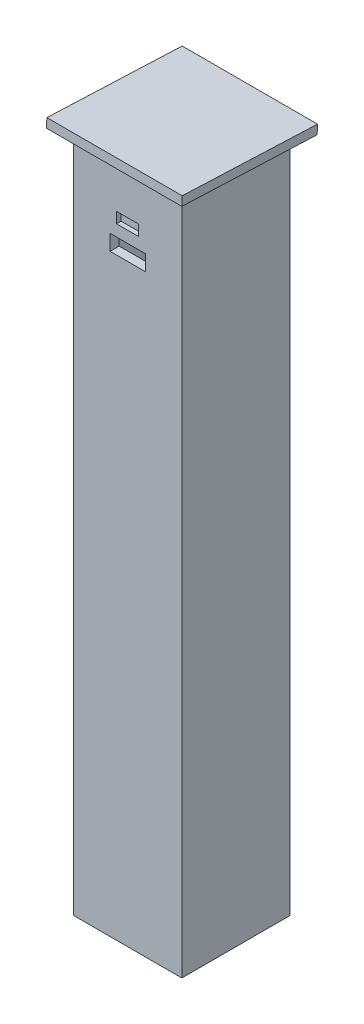
ISO-10303-21;
HEADER;
FILE_DESCRIPTION(('STEP AP214'),'2;1');
FILE_NAME('part.step','',(''),(''),'','','');
FILE_SCHEMA(('AUTOMOTIVE_DESIGN { 1 0 10303 214 1 1 1 1 }'));
ENDSEC;
DATA;
#1=APPLICATION_CONTEXT('core data for automotive mechanical design processes');
#2=APPLICATION_PROTOCOL_DEFINITION('international standard','automotive_design',2000,#1);
#3=PRODUCT_CONTEXT('',#1,'mechanical');
#4=PRODUCT('Part','Part','',(#3));
#5=PRODUCT_RELATED_PRODUCT_CATEGORY('part','',(#4));
#6=PRODUCT_DEFINITION_FORMATION('','',#4);
#7=PRODUCT_DEFINITION_CONTEXT('part definition',#1,'design');
#8=PRODUCT_DEFINITION('design','',#6,#7);
#9=PRODUCT_DEFINITION_SHAPE('','',#8);
#10=(LENGTH_UNIT() NAMED_UNIT(*) SI_UNIT(.MILLI.,.METRE.));
#11=(NAMED_UNIT(*) PLANE_ANGLE_UNIT() SI_UNIT($,.RADIAN.));
#12=(NAMED_UNIT(*) SI_UNIT($,.STERADIAN.) SOLID_ANGLE_UNIT());
#13=UNCERTAINTY_MEASURE_WITH_UNIT(LENGTH_MEASURE(1.E-05),#10,'distance_accuracy_value','');
#14=(GEOMETRIC_REPRESENTATION_CONTEXT(3) GLOBAL_UNCERTAINTY_ASSIGNED_CONTEXT((#13)) GLOBAL_UNIT_ASSIGNED_CONTEXT((#10,
#11,#12)) REPRESENTATION_CONTEXT('',''));
#15=CARTESIAN_POINT('',(0.,0.,0.));
#16=DIRECTION('',(0.,0.,1.));
#17=DIRECTION('',(1.,0.,0.));
#18=AXIS2_PLACEMENT_3D('',#15,#16,#17);
#19=CARTESIAN_POINT('',(0.,0.,0.));
#20=DIRECTION('',(0.,1.,0.));
#21=DIRECTION('',(0.,0.,1.));
#22=AXIS2_PLACEMENT_3D('',#19,#20,#21);
#23=PLANE('',#22);
#24=DIRECTION('',(0.,0.,1.));
#25=VECTOR('',#24,1.);
#26=CARTESIAN_POINT('',(-283.32278927247,0.,-148.351621739989));
#27=LINE('',#26,#25);
#28=CARTESIAN_POINT('',(-283.32278927247,0.,-148.351621739989));
#29=VERTEX_POINT('',#28);
#30=CARTESIAN_POINT('',(-283.32278927247,0.,91.6483782600111));
#31=VERTEX_POINT('',#30);
#32=EDGE_CURVE('E313',#29,#31,#27,.T.);
#33=ORIENTED_EDGE('',*,*,#32,.F.);
#34=DIRECTION('',(-1.,0.,0.));
#35=VECTOR('',#34,1.);
#36=CARTESIAN_POINT('',(-283.32278927247,0.,-148.351621739989));
#37=LINE('',#36,#35);
#38=CARTESIAN_POINT('',(-43.3227892724702,0.,-148.351621739989));
#39=VERTEX_POINT('',#38);
#40=EDGE_CURVE('E317',#39,#29,#37,.T.);
#41=ORIENTED_EDGE('',*,*,#40,.F.);
#42=DIRECTION('',(0.,0.,-1.));
#43=VECTOR('',#42,1.);
#44=CARTESIAN_POINT('',(-43.3227892724702,0.,-148.351621739989));
#45=LINE('',#44,#43);
#46=CARTESIAN_POINT('',(-43.3227892724702,0.,91.6483782600111));
#47=VERTEX_POINT('',#46);
#48=EDGE_CURVE('E322',#47,#39,#45,.T.);
#49=ORIENTED_EDGE('',*,*,#48,.F.);
#50=DIRECTION('',(1.,0.,0.));
#51=VECTOR('',#50,1.);
#52=CARTESIAN_POINT('',(-283.32278927247,0.,91.6483782600111));
#53=LINE('',#52,#51);
#54=EDGE_CURVE('E320',#31,#47,#53,.T.);
#55=ORIENTED_EDGE('',*,*,#54,.F.);
#56=EDGE_LOOP('',(#33,#41,#49,#55));
#57=FACE_BOUND('',#56,.T.);
#58=DIRECTION('',(0.,0.,1.));
#59=VECTOR('',#58,1.);
#60=CARTESIAN_POINT('',(-263.32278927247,0.,-128.351621739989));
#61=LINE('',#60,#59);
#62=CARTESIAN_POINT('',(-263.32278927247,0.,-128.351621739989));
#63=VERTEX_POINT('',#62);
#64=CARTESIAN_POINT('',(-263.32278927247,0.,71.6483782600111));
#65=VERTEX_POINT('',#64);
#66=EDGE_CURVE('E279',#63,#65,#61,.T.);
#67=ORIENTED_EDGE('',*,*,#66,.T.);
#68=DIRECTION('',(1.,0.,0.));
#69=VECTOR('',#68,1.);
#70=CARTESIAN_POINT('',(-263.32278927247,0.,71.6483782600111));
#71=LINE('',#70,#69);
#72=CARTESIAN_POINT('',(-63.3227892724702,0.,71.6483782600111));
#73=VERTEX_POINT('',#72);
#74=EDGE_CURVE('E296',#65,#73,#71,.T.);
#75=ORIENTED_EDGE('',*,*,#74,.T.);
#76=DIRECTION('',(0.,0.,-1.));
#77=VECTOR('',#76,1.);
#78=CARTESIAN_POINT('',(-63.3227892724702,0.,-128.351621739989));
#79=LINE('',#78,#77);
#80=CARTESIAN_POINT('',(-63.3227892724702,0.,-128.351621739989));
#81=VERTEX_POINT('',#80);
#82=EDGE_CURVE('E299',#73,#81,#79,.T.);
#83=ORIENTED_EDGE('',*,*,#82,.T.);
#84=DIRECTION('',(-1.,0.,0.));
#85=VECTOR('',#84,1.);
#86=CARTESIAN_POINT('',(-263.32278927247,0.,-128.351621739989));
#87=LINE('',#86,#85);
#88=EDGE_CURVE('E284',#81,#63,#87,.T.);
#89=ORIENTED_EDGE('',*,*,#88,.T.);
#90=EDGE_LOOP('',(#67,#75,#83,#89));
#91=FACE_BOUND('',#90,.T.);
#92=ADVANCED_FACE('F34',(#57,#91),#23,.F.);
#93=CARTESIAN_POINT('',(-283.32278927247,1500.,-148.351621739989));
#94=DIRECTION('',(1.,0.,0.));
#95=DIRECTION('',(0.,0.,-1.));
#96=AXIS2_PLACEMENT_3D('',#93,#94,#95);
#97=PLANE('',#96);
#98=ORIENTED_EDGE('',*,*,#32,.T.);
#99=DIRECTION('',(0.,-1.,0.));
#100=VECTOR('',#99,1.);
#101=CARTESIAN_POINT('',(-283.32278927247,1500.,91.6483782600111));
#102=LINE('',#101,#100);
#103=CARTESIAN_POINT('',(-283.32278927247,1510.,91.6483782600111));
#104=VERTEX_POINT('',#103);
#105=EDGE_CURVE('E11',#104,#31,#102,.T.);
#106=ORIENTED_EDGE('',*,*,#105,.F.);
#107=DIRECTION('',(0.,-0.0416305447121814,-0.999133073092352));
#108=VECTOR('',#107,1.);
#109=CARTESIAN_POINT('',(-283.32278927247,1510.,91.6483782600111));
#110=LINE('',#109,#108);
#111=CARTESIAN_POINT('',(-283.32278927247,1500.,-148.351621739989));
#112=VERTEX_POINT('',#111);
#113=EDGE_CURVE('E240',#104,#112,#110,.T.);
#114=ORIENTED_EDGE('',*,*,#113,.T.);
#115=DIRECTION('',(0.,-1.,0.));
#116=VECTOR('',#115,1.);
#117=CARTESIAN_POINT('',(-283.32278927247,1500.,-148.351621739989));
#118=LINE('',#117,#116);
#119=EDGE_CURVE('E316',#112,#29,#118,.T.);
#120=ORIENTED_EDGE('',*,*,#119,.T.);
#121=EDGE_LOOP('',(#98,#106,#114,#120));
#122=FACE_BOUND('',#121,.T.);
#123=ADVANCED_FACE('F36',(#122),#97,.F.);
#124=CARTESIAN_POINT('',(-283.32278927247,1500.,91.6483782600111));
#125=DIRECTION('',(0.,0.,-1.));
#126=DIRECTION('',(-1.,0.,0.));
#127=AXIS2_PLACEMENT_3D('',#124,#125,#126);
#128=PLANE('',#127);
#129=DIRECTION('',(1.,0.,0.));
#130=VECTOR('',#129,1.);
#131=CARTESIAN_POINT('',(-187.82278927247,1375.5,91.6483782600111));
#132=LINE('',#131,#130);
#133=CARTESIAN_POINT('',(-187.82278927247,1375.5,91.6483782600111));
#134=VERTEX_POINT('',#133);
#135=CARTESIAN_POINT('',(-138.82278927247,1375.5,91.6483782600111));
#136=VERTEX_POINT('',#135);
#137=EDGE_CURVE('E201',#134,#136,#132,.T.);
#138=ORIENTED_EDGE('',*,*,#137,.F.);
#139=DIRECTION('',(0.,-1.,0.));
#140=VECTOR('',#139,1.);
#141=CARTESIAN_POINT('',(-187.82278927247,1399.5,91.6483782600111));
#142=LINE('',#141,#140);
#143=CARTESIAN_POINT('',(-187.82278927247,1399.5,91.6483782600111));
#144=VERTEX_POINT('',#143);
#145=EDGE_CURVE('E49',#144,#134,#142,.T.);
#146=ORIENTED_EDGE('',*,*,#145,.F.);
#147=DIRECTION('',(-1.,0.,0.));
#148=VECTOR('',#147,1.);
#149=CARTESIAN_POINT('',(-187.82278927247,1399.5,91.6483782600111));
#150=LINE('',#149,#148);
#151=CARTESIAN_POINT('',(-138.82278927247,1399.5,91.6483782600111));
#152=VERTEX_POINT('',#151);
#153=EDGE_CURVE('E192',#152,#144,#150,.T.);
#154=ORIENTED_EDGE('',*,*,#153,.F.);
#155=DIRECTION('',(0.,1.,0.));
#156=VECTOR('',#155,1.);
#157=CARTESIAN_POINT('',(-138.82278927247,1399.5,91.6483782600111));
#158=LINE('',#157,#156);
#159=EDGE_CURVE('E195',#136,#152,#158,.T.);
#160=ORIENTED_EDGE('',*,*,#159,.F.);
#161=EDGE_LOOP('',(#138,#146,#154,#160));
#162=FACE_BOUND('',#161,.T.);
#163=DIRECTION('',(0.,1.,0.));
#164=VECTOR('',#163,1.);
#165=CARTESIAN_POINT('',(-124.32278927247,1350.,91.6483782600111));
#166=LINE('',#165,#164);
#167=CARTESIAN_POINT('',(-124.32278927247,1315.5,91.6483782600111));
#168=VERTEX_POINT('',#167);
#169=CARTESIAN_POINT('',(-124.32278927247,1350.,91.6483782600111));
#170=VERTEX_POINT('',#169);
#171=EDGE_CURVE('E252',#168,#170,#166,.T.);
#172=ORIENTED_EDGE('',*,*,#171,.F.);
#173=DIRECTION('',(1.,0.,0.));
#174=VECTOR('',#173,1.);
#175=CARTESIAN_POINT('',(-202.32278927247,1315.5,91.6483782600111));
#176=LINE('',#175,#174);
#177=CARTESIAN_POINT('',(-202.32278927247,1315.5,91.6483782600111));
#178=VERTEX_POINT('',#177);
#179=EDGE_CURVE('E255',#178,#168,#176,.T.);
#180=ORIENTED_EDGE('',*,*,#179,.F.);
#181=DIRECTION('',(0.,-1.,0.));
#182=VECTOR('',#181,1.);
#183=CARTESIAN_POINT('',(-202.32278927247,1350.,91.6483782600111));
#184=LINE('',#183,#182);
#185=CARTESIAN_POINT('',(-202.32278927247,1350.,91.6483782600111));
#186=VERTEX_POINT('',#185);
#187=EDGE_CURVE('E244',#186,#178,#184,.T.);
#188=ORIENTED_EDGE('',*,*,#187,.F.);
#189=DIRECTION('',(-1.,0.,0.));
#190=VECTOR('',#189,1.);
#191=CARTESIAN_POINT('',(-202.32278927247,1350.,91.6483782600111));
#192=LINE('',#191,#190);
#193=EDGE_CURVE('E57',#170,#186,#192,.T.);
#194=ORIENTED_EDGE('',*,*,#193,.F.);
#195=EDGE_LOOP('',(#172,#180,#188,#194));
#196=FACE_BOUND('',#195,.T.);
#197=ORIENTED_EDGE('',*,*,#54,.T.);
#198=DIRECTION('',(0.,-1.,0.));
#199=VECTOR('',#198,1.);
#200=CARTESIAN_POINT('',(-43.3227892724702,1500.,91.6483782600111));
#201=LINE('',#200,#199);
#202=CARTESIAN_POINT('',(-43.3227892724702,1510.,91.6483782600111));
#203=VERTEX_POINT('',#202);
#204=EDGE_CURVE('E42',#203,#47,#201,.T.);
#205=ORIENTED_EDGE('',*,*,#204,.F.);
#206=DIRECTION('',(-1.,0.,0.));
#207=VECTOR('',#206,1.);
#208=CARTESIAN_POINT('',(196.885453716816,1510.,91.6483782600111));
#209=LINE('',#208,#207);
#210=EDGE_CURVE('E245',#203,#104,#209,.T.);
#211=ORIENTED_EDGE('',*,*,#210,.T.);
#212=ORIENTED_EDGE('',*,*,#105,.T.);
#213=EDGE_LOOP('',(#197,#205,#211,#212));
#214=FACE_BOUND('',#213,.T.);
#215=ADVANCED_FACE('F349',(#162,#196,#214),#128,.F.);
#216=CARTESIAN_POINT('',(-43.3227892724702,1500.,-148.351621739989));
#217=DIRECTION('',(-1.,0.,0.));
#218=DIRECTION('',(0.,0.,1.));
#219=AXIS2_PLACEMENT_3D('',#216,#217,#218);
#220=PLANE('',#219);
#221=ORIENTED_EDGE('',*,*,#48,.T.);
#222=DIRECTION('',(0.,-1.,0.));
#223=VECTOR('',#222,1.);
#224=CARTESIAN_POINT('',(-43.3227892724702,1500.,-148.351621739989));
#225=LINE('',#224,#223);
#226=CARTESIAN_POINT('',(-43.3227892724702,1500.,-148.351621739989));
#227=VERTEX_POINT('',#226);
#228=EDGE_CURVE('E327',#227,#39,#225,.T.);
#229=ORIENTED_EDGE('',*,*,#228,.F.);
#230=DIRECTION('',(0.,0.0416305447121814,0.999133073092352));
#231=VECTOR('',#230,1.);
#232=CARTESIAN_POINT('',(-43.3227892724702,1510.,91.6483782600111));
#233=LINE('',#232,#231);
#234=EDGE_CURVE('E241',#227,#203,#233,.T.);
#235=ORIENTED_EDGE('',*,*,#234,.T.);
#236=ORIENTED_EDGE('',*,*,#204,.T.);
#237=EDGE_LOOP('',(#221,#229,#235,#236));
#238=FACE_BOUND('',#237,.T.);
#239=ADVANCED_FACE('F333',(#238),#220,.F.);
#240=CARTESIAN_POINT('',(-283.32278927247,1500.,-148.351621739989));
#241=DIRECTION('',(0.,0.,1.));
#242=DIRECTION('',(1.,0.,0.));
#243=AXIS2_PLACEMENT_3D('',#240,#241,#242);
#244=PLANE('',#243);
#245=ORIENTED_EDGE('',*,*,#40,.T.);
#246=ORIENTED_EDGE('',*,*,#119,.F.);
#247=DIRECTION('',(-1.,0.,0.));
#248=VECTOR('',#247,1.);
#249=CARTESIAN_POINT('',(-283.32278927247,1500.,-148.351621739989));
#250=LINE('',#249,#248);
#251=EDGE_CURVE('E314',#227,#112,#250,.T.);
#252=ORIENTED_EDGE('',*,*,#251,.F.);
#253=ORIENTED_EDGE('',*,*,#228,.T.);
#254=EDGE_LOOP('',(#245,#246,#252,#253));
#255=FACE_BOUND('',#254,.T.);
#256=ADVANCED_FACE('F342',(#255),#244,.F.);
#257=CARTESIAN_POINT('',(-263.32278927247,1500.,-128.351621739989));
#258=DIRECTION('',(1.,0.,0.));
#259=DIRECTION('',(0.,0.,-1.));
#260=AXIS2_PLACEMENT_3D('',#257,#258,#259);
#261=PLANE('',#260);
#262=ORIENTED_EDGE('',*,*,#66,.F.);
#263=DIRECTION('',(0.,-1.,0.));
#264=VECTOR('',#263,1.);
#265=CARTESIAN_POINT('',(-263.32278927247,1500.,-128.351621739989));
#266=LINE('',#265,#264);
#267=CARTESIAN_POINT('',(-263.32278927247,1500.,-128.351621739989));
#268=VERTEX_POINT('',#267);
#269=EDGE_CURVE('E293',#268,#63,#266,.T.);
#270=ORIENTED_EDGE('',*,*,#269,.F.);
#271=DIRECTION('',(0.,0.,1.));
#272=VECTOR('',#271,1.);
#273=CARTESIAN_POINT('',(-263.32278927247,1500.,-128.351621739989));
#274=LINE('',#273,#272);
#275=CARTESIAN_POINT('',(-263.32278927247,1500.,71.6483782600111));
#276=VERTEX_POINT('',#275);
#277=EDGE_CURVE('E280',#268,#276,#274,.T.);
#278=ORIENTED_EDGE('',*,*,#277,.T.);
#279=DIRECTION('',(0.,-1.,0.));
#280=VECTOR('',#279,1.);
#281=CARTESIAN_POINT('',(-263.32278927247,1500.,71.6483782600111));
#282=LINE('',#281,#280);
#283=EDGE_CURVE('E310',#276,#65,#282,.T.);
#284=ORIENTED_EDGE('',*,*,#283,.T.);
#285=EDGE_LOOP('',(#262,#270,#278,#284));
#286=FACE_BOUND('',#285,.T.);
#287=ADVANCED_FACE('F364',(#286),#261,.T.);
#288=CARTESIAN_POINT('',(-263.32278927247,1500.,71.6483782600111));
#289=DIRECTION('',(0.,0.,-1.));
#290=DIRECTION('',(-1.,0.,0.));
#291=AXIS2_PLACEMENT_3D('',#288,#289,#290);
#292=PLANE('',#291);
#293=DIRECTION('',(1.,0.,0.));
#294=VECTOR('',#293,1.);
#295=CARTESIAN_POINT('',(-202.32278927247,1315.5,71.6483782600111));
#296=LINE('',#295,#294);
#297=CARTESIAN_POINT('',(-202.32278927247,1315.5,71.6483782600111));
#298=VERTEX_POINT('',#297);
#299=CARTESIAN_POINT('',(-124.32278927247,1315.5,71.6483782600111));
#300=VERTEX_POINT('',#299);
#301=EDGE_CURVE('E251',#298,#300,#296,.T.);
#302=ORIENTED_EDGE('',*,*,#301,.T.);
#303=DIRECTION('',(0.,1.,0.));
#304=VECTOR('',#303,1.);
#305=CARTESIAN_POINT('',(-124.32278927247,1350.,71.6483782600111));
#306=LINE('',#305,#304);
#307=CARTESIAN_POINT('',(-124.32278927247,1350.,71.6483782600111));
#308=VERTEX_POINT('',#307);
#309=EDGE_CURVE('E272',#300,#308,#306,.T.);
#310=ORIENTED_EDGE('',*,*,#309,.T.);
#311=DIRECTION('',(-1.,0.,0.));
#312=VECTOR('',#311,1.);
#313=CARTESIAN_POINT('',(-202.32278927247,1350.,71.6483782600111));
#314=LINE('',#313,#312);
#315=CARTESIAN_POINT('',(-202.32278927247,1350.,71.6483782600111));
#316=VERTEX_POINT('',#315);
#317=EDGE_CURVE('E268',#308,#316,#314,.T.);
#318=ORIENTED_EDGE('',*,*,#317,.T.);
#319=DIRECTION('',(0.,-1.,0.));
#320=VECTOR('',#319,1.);
#321=CARTESIAN_POINT('',(-202.32278927247,1350.,71.6483782600111));
#322=LINE('',#321,#320);
#323=EDGE_CURVE('E263',#316,#298,#322,.T.);
#324=ORIENTED_EDGE('',*,*,#323,.T.);
#325=EDGE_LOOP('',(#302,#310,#318,#324));
#326=FACE_BOUND('',#325,.T.);
#327=ORIENTED_EDGE('',*,*,#74,.F.);
#328=ORIENTED_EDGE('',*,*,#283,.F.);
#329=DIRECTION('',(1.,0.,0.));
#330=VECTOR('',#329,1.);
#331=CARTESIAN_POINT('',(-263.32278927247,1500.,71.6483782600111));
#332=LINE('',#331,#330);
#333=CARTESIAN_POINT('',(-63.3227892724702,1500.,71.6483782600111));
#334=VERTEX_POINT('',#333);
#335=EDGE_CURVE('E283',#276,#334,#332,.T.);
#336=ORIENTED_EDGE('',*,*,#335,.T.);
#337=DIRECTION('',(0.,-1.,0.));
#338=VECTOR('',#337,1.);
#339=CARTESIAN_POINT('',(-63.3227892724702,1500.,71.6483782600111));
#340=LINE('',#339,#338);
#341=EDGE_CURVE('E308',#334,#73,#340,.T.);
#342=ORIENTED_EDGE('',*,*,#341,.T.);
#343=EDGE_LOOP('',(#327,#328,#336,#342));
#344=FACE_BOUND('',#343,.T.);
#345=ADVANCED_FACE('F370',(#326,#344),#292,.T.);
#346=CARTESIAN_POINT('',(-63.3227892724702,1500.,-128.351621739989));
#347=DIRECTION('',(-1.,0.,0.));
#348=DIRECTION('',(0.,0.,1.));
#349=AXIS2_PLACEMENT_3D('',#346,#347,#348);
#350=PLANE('',#349);
#351=ORIENTED_EDGE('',*,*,#82,.F.);
#352=ORIENTED_EDGE('',*,*,#341,.F.);
#353=DIRECTION('',(0.,0.,-1.));
#354=VECTOR('',#353,1.);
#355=CARTESIAN_POINT('',(-63.3227892724702,1500.,-128.351621739989));
#356=LINE('',#355,#354);
#357=CARTESIAN_POINT('',(-63.3227892724702,1500.,-128.351621739989));
#358=VERTEX_POINT('',#357);
#359=EDGE_CURVE('E287',#334,#358,#356,.T.);
#360=ORIENTED_EDGE('',*,*,#359,.T.);
#361=DIRECTION('',(0.,-1.,0.));
#362=VECTOR('',#361,1.);
#363=CARTESIAN_POINT('',(-63.3227892724702,1500.,-128.351621739989));
#364=LINE('',#363,#362);
#365=EDGE_CURVE('E306',#358,#81,#364,.T.);
#366=ORIENTED_EDGE('',*,*,#365,.T.);
#367=EDGE_LOOP('',(#351,#352,#360,#366));
#368=FACE_BOUND('',#367,.T.);
#369=ADVANCED_FACE('F375',(#368),#350,.T.);
#370=CARTESIAN_POINT('',(-263.32278927247,1500.,-128.351621739989));
#371=DIRECTION('',(0.,0.,1.));
#372=DIRECTION('',(1.,0.,0.));
#373=AXIS2_PLACEMENT_3D('',#370,#371,#372);
#374=PLANE('',#373);
#375=ORIENTED_EDGE('',*,*,#88,.F.);
#376=ORIENTED_EDGE('',*,*,#365,.F.);
#377=DIRECTION('',(-1.,0.,0.));
#378=VECTOR('',#377,1.);
#379=CARTESIAN_POINT('',(-263.32278927247,1500.,-128.351621739989));
#380=LINE('',#379,#378);
#381=EDGE_CURVE('E290',#358,#268,#380,.T.);
#382=ORIENTED_EDGE('',*,*,#381,.T.);
#383=ORIENTED_EDGE('',*,*,#269,.T.);
#384=EDGE_LOOP('',(#375,#376,#382,#383));
#385=FACE_BOUND('',#384,.T.);
#386=ADVANCED_FACE('F381',(#385),#374,.T.);
#387=CARTESIAN_POINT('',(-202.32278927247,1315.5,-13.6408355949659));
#388=DIRECTION('',(0.,-1.,0.));
#389=DIRECTION('',(0.,0.,-1.));
#390=AXIS2_PLACEMENT_3D('',#387,#388,#389);
#391=PLANE('',#390);
#392=DIRECTION('',(0.,0.,1.));
#393=VECTOR('',#392,1.);
#394=CARTESIAN_POINT('',(-202.32278927247,1315.5,-13.6408355949659));
#395=LINE('',#394,#393);
#396=EDGE_CURVE('E266',#298,#178,#395,.T.);
#397=ORIENTED_EDGE('',*,*,#396,.T.);
#398=ORIENTED_EDGE('',*,*,#179,.T.);
#399=DIRECTION('',(0.,0.,1.));
#400=VECTOR('',#399,1.);
#401=CARTESIAN_POINT('',(-124.32278927247,1315.5,-13.6408355949659));
#402=LINE('',#401,#400);
#403=EDGE_CURVE('E262',#300,#168,#402,.T.);
#404=ORIENTED_EDGE('',*,*,#403,.F.);
#405=ORIENTED_EDGE('',*,*,#301,.F.);
#406=EDGE_LOOP('',(#397,#398,#404,#405));
#407=FACE_BOUND('',#406,.T.);
#408=ADVANCED_FACE('F410',(#407),#391,.F.);
#409=CARTESIAN_POINT('',(-124.32278927247,1350.,-13.6408355949659));
#410=DIRECTION('',(1.,0.,0.));
#411=DIRECTION('',(0.,0.,-1.));
#412=AXIS2_PLACEMENT_3D('',#409,#410,#411);
#413=PLANE('',#412);
#414=ORIENTED_EDGE('',*,*,#403,.T.);
#415=ORIENTED_EDGE('',*,*,#171,.T.);
#416=DIRECTION('',(0.,0.,1.));
#417=VECTOR('',#416,1.);
#418=CARTESIAN_POINT('',(-124.32278927247,1350.,-13.6408355949659));
#419=LINE('',#418,#417);
#420=EDGE_CURVE('E271',#308,#170,#419,.T.);
#421=ORIENTED_EDGE('',*,*,#420,.F.);
#422=ORIENTED_EDGE('',*,*,#309,.F.);
#423=EDGE_LOOP('',(#414,#415,#421,#422));
#424=FACE_BOUND('',#423,.T.);
#425=ADVANCED_FACE('F407',(#424),#413,.F.);
#426=CARTESIAN_POINT('',(-202.32278927247,1350.,-13.6408355949659));
#427=DIRECTION('',(0.,1.,0.));
#428=DIRECTION('',(0.,0.,1.));
#429=AXIS2_PLACEMENT_3D('',#426,#427,#428);
#430=PLANE('',#429);
#431=ORIENTED_EDGE('',*,*,#420,.T.);
#432=ORIENTED_EDGE('',*,*,#193,.T.);
#433=DIRECTION('',(0.,0.,1.));
#434=VECTOR('',#433,1.);
#435=CARTESIAN_POINT('',(-202.32278927247,1350.,-13.6408355949659));
#436=LINE('',#435,#434);
#437=EDGE_CURVE('E267',#316,#186,#436,.T.);
#438=ORIENTED_EDGE('',*,*,#437,.F.);
#439=ORIENTED_EDGE('',*,*,#317,.F.);
#440=EDGE_LOOP('',(#431,#432,#438,#439));
#441=FACE_BOUND('',#440,.T.);
#442=ADVANCED_FACE('F400',(#441),#430,.F.);
#443=CARTESIAN_POINT('',(-202.32278927247,1350.,-13.6408355949659));
#444=DIRECTION('',(-1.,0.,0.));
#445=DIRECTION('',(0.,0.,1.));
#446=AXIS2_PLACEMENT_3D('',#443,#444,#445);
#447=PLANE('',#446);
#448=ORIENTED_EDGE('',*,*,#437,.T.);
#449=ORIENTED_EDGE('',*,*,#187,.T.);
#450=ORIENTED_EDGE('',*,*,#396,.F.);
#451=ORIENTED_EDGE('',*,*,#323,.F.);
#452=EDGE_LOOP('',(#448,#449,#450,#451));
#453=FACE_BOUND('',#452,.T.);
#454=ADVANCED_FACE('F391',(#453),#447,.F.);
#455=CARTESIAN_POINT('',(196.885453716816,1500.,-148.351621739989));
#456=DIRECTION('',(0.,-1.,0.));
#457=DIRECTION('',(0.,0.,-1.));
#458=AXIS2_PLACEMENT_3D('',#455,#456,#457);
#459=PLANE('',#458);
#460=ORIENTED_EDGE('',*,*,#335,.F.);
#461=ORIENTED_EDGE('',*,*,#277,.F.);
#462=ORIENTED_EDGE('',*,*,#381,.F.);
#463=ORIENTED_EDGE('',*,*,#359,.F.);
#464=EDGE_LOOP('',(#460,#461,#462,#463));
#465=FACE_BOUND('',#464,.T.);
#466=ADVANCED_FACE('F387',(#465),#459,.T.);
#467=CARTESIAN_POINT('',(-313.32278927247,1518.73374512048,-179.158224827003));
#468=DIRECTION('',(1.,0.,0.));
#469=DIRECTION('',(0.,0.,-1.));
#470=AXIS2_PLACEMENT_3D('',#467,#468,#469);
#471=PLANE('',#470);
#472=DIRECTION('',(0.,0.0416305447121816,0.999133073092352));
#473=VECTOR('',#472,1.);
#474=CARTESIAN_POINT('',(-313.32278927247,1498.75108365864,-178.325613932759));
#475=LINE('',#474,#473);
#476=CARTESIAN_POINT('',(-313.32278927247,1498.75108365864,-178.325613932759));
#477=VERTEX_POINT('',#476);
#478=CARTESIAN_POINT('',(-313.32278927247,1511.24891634137,121.622370452782));
#479=VERTEX_POINT('',#478);
#480=EDGE_CURVE('E207',#477,#479,#475,.T.);
#481=ORIENTED_EDGE('',*,*,#480,.T.);
#482=DIRECTION('',(0.,-0.999133073092352,0.0416305447121814));
#483=VECTOR('',#482,1.);
#484=CARTESIAN_POINT('',(-313.32278927247,1531.23157780321,120.789759558538));
#485=LINE('',#484,#483);
#486=CARTESIAN_POINT('',(-313.32278927247,1531.23157780321,120.789759558538));
#487=VERTEX_POINT('',#486);
#488=EDGE_CURVE('E237',#487,#479,#485,.T.);
#489=ORIENTED_EDGE('',*,*,#488,.F.);
#490=DIRECTION('',(0.,0.0416305447121816,0.999133073092352));
#491=VECTOR('',#490,1.);
#492=CARTESIAN_POINT('',(-313.32278927247,1518.73374512048,-179.158224827003));
#493=LINE('',#492,#491);
#494=CARTESIAN_POINT('',(-313.32278927247,1518.73374512048,-179.158224827003));
#495=VERTEX_POINT('',#494);
#496=EDGE_CURVE('E211',#495,#487,#493,.T.);
#497=ORIENTED_EDGE('',*,*,#496,.F.);
#498=DIRECTION('',(0.,-0.999133073092352,0.0416305447121814));
#499=VECTOR('',#498,1.);
#500=CARTESIAN_POINT('',(-313.32278927247,1518.73374512048,-179.158224827003));
#501=LINE('',#500,#499);
#502=EDGE_CURVE('E221',#495,#477,#501,.T.);
#503=ORIENTED_EDGE('',*,*,#502,.T.);
#504=EDGE_LOOP('',(#481,#489,#497,#503));
#505=FACE_BOUND('',#504,.T.);
#506=ADVANCED_FACE('F390',(#505),#471,.F.);
#507=CARTESIAN_POINT('',(-313.32278927247,1531.23157780321,120.789759558538));
#508=DIRECTION('',(0.,-0.0416305447121814,-0.999133073092352));
#509=DIRECTION('',(0.,0.999133073092352,-0.0416305447121814));
#510=AXIS2_PLACEMENT_3D('',#507,#508,#509);
#511=PLANE('',#510);
#512=DIRECTION('',(1.,0.,0.));
#513=VECTOR('',#512,1.);
#514=CARTESIAN_POINT('',(-313.32278927247,1511.24891634137,121.622370452782));
#515=LINE('',#514,#513);
#516=CARTESIAN_POINT('',(-13.3227892724702,1511.24891634137,121.622370452782));
#517=VERTEX_POINT('',#516);
#518=EDGE_CURVE('E224',#479,#517,#515,.T.);
#519=ORIENTED_EDGE('',*,*,#518,.T.);
#520=DIRECTION('',(0.,-0.999133073092352,0.0416305447121814));
#521=VECTOR('',#520,1.);
#522=CARTESIAN_POINT('',(-13.3227892724702,1531.23157780321,120.789759558538));
#523=LINE('',#522,#521);
#524=CARTESIAN_POINT('',(-13.3227892724702,1531.23157780321,120.789759558538));
#525=VERTEX_POINT('',#524);
#526=EDGE_CURVE('E234',#525,#517,#523,.T.);
#527=ORIENTED_EDGE('',*,*,#526,.F.);
#528=DIRECTION('',(1.,0.,0.));
#529=VECTOR('',#528,1.);
#530=CARTESIAN_POINT('',(-313.32278927247,1531.23157780321,120.789759558538));
#531=LINE('',#530,#529);
#532=EDGE_CURVE('E214',#487,#525,#531,.T.);
#533=ORIENTED_EDGE('',*,*,#532,.F.);
#534=ORIENTED_EDGE('',*,*,#488,.T.);
#535=EDGE_LOOP('',(#519,#527,#533,#534));
#536=FACE_BOUND('',#535,.T.);
#537=ADVANCED_FACE('F397',(#536),#511,.F.);
#538=CARTESIAN_POINT('',(-13.3227892724702,1518.73374512048,-179.158224827003));
#539=DIRECTION('',(-1.,0.,0.));
#540=DIRECTION('',(0.,0.,1.));
#541=AXIS2_PLACEMENT_3D('',#538,#539,#540);
#542=PLANE('',#541);
#543=DIRECTION('',(0.,-0.0416305447121816,-0.999133073092352));
#544=VECTOR('',#543,1.);
#545=CARTESIAN_POINT('',(-13.3227892724702,1498.75108365864,-178.325613932759));
#546=LINE('',#545,#544);
#547=CARTESIAN_POINT('',(-13.3227892724702,1498.75108365864,-178.325613932759));
#548=VERTEX_POINT('',#547);
#549=EDGE_CURVE('E226',#517,#548,#546,.T.);
#550=ORIENTED_EDGE('',*,*,#549,.T.);
#551=DIRECTION('',(0.,-0.999133073092352,0.0416305447121814));
#552=VECTOR('',#551,1.);
#553=CARTESIAN_POINT('',(-13.3227892724702,1518.73374512048,-179.158224827003));
#554=LINE('',#553,#552);
#555=CARTESIAN_POINT('',(-13.3227892724702,1518.73374512048,-179.158224827003));
#556=VERTEX_POINT('',#555);
#557=EDGE_CURVE('E231',#556,#548,#554,.T.);
#558=ORIENTED_EDGE('',*,*,#557,.F.);
#559=DIRECTION('',(0.,-0.0416305447121816,-0.999133073092352));
#560=VECTOR('',#559,1.);
#561=CARTESIAN_POINT('',(-13.3227892724702,1518.73374512048,-179.158224827003));
#562=LINE('',#561,#560);
#563=EDGE_CURVE('E217',#525,#556,#562,.T.);
#564=ORIENTED_EDGE('',*,*,#563,.F.);
#565=ORIENTED_EDGE('',*,*,#526,.T.);
#566=EDGE_LOOP('',(#550,#558,#564,#565));
#567=FACE_BOUND('',#566,.T.);
#568=ADVANCED_FACE('F511',(#567),#542,.F.);
#569=CARTESIAN_POINT('',(-313.32278927247,1518.73374512048,-179.158224827003));
#570=DIRECTION('',(0.,0.0416305447121814,0.999133073092352));
#571=DIRECTION('',(0.,-0.999133073092352,0.0416305447121814));
#572=AXIS2_PLACEMENT_3D('',#569,#570,#571);
#573=PLANE('',#572);
#574=DIRECTION('',(-1.,0.,0.));
#575=VECTOR('',#574,1.);
#576=CARTESIAN_POINT('',(-313.32278927247,1498.75108365864,-178.325613932759));
#577=LINE('',#576,#575);
#578=EDGE_CURVE('E215',#548,#477,#577,.T.);
#579=ORIENTED_EDGE('',*,*,#578,.T.);
#580=ORIENTED_EDGE('',*,*,#502,.F.);
#581=DIRECTION('',(-1.,0.,0.));
#582=VECTOR('',#581,1.);
#583=CARTESIAN_POINT('',(-313.32278927247,1518.73374512048,-179.158224827003));
#584=LINE('',#583,#582);
#585=EDGE_CURVE('E219',#556,#495,#584,.T.);
#586=ORIENTED_EDGE('',*,*,#585,.F.);
#587=ORIENTED_EDGE('',*,*,#557,.T.);
#588=EDGE_LOOP('',(#579,#580,#586,#587));
#589=FACE_BOUND('',#588,.T.);
#590=ADVANCED_FACE('F519',(#589),#573,.F.);
#591=CARTESIAN_POINT('',(0.,1523.55361279939,-63.4814005333082));
#592=DIRECTION('',(0.,0.999133073092352,-0.0416305447121816));
#593=DIRECTION('',(0.,0.0416305447121816,0.999133073092352));
#594=AXIS2_PLACEMENT_3D('',#591,#592,#593);
#595=PLANE('',#594);
#596=ORIENTED_EDGE('',*,*,#496,.T.);
#597=ORIENTED_EDGE('',*,*,#532,.T.);
#598=ORIENTED_EDGE('',*,*,#563,.T.);
#599=ORIENTED_EDGE('',*,*,#585,.T.);
#600=EDGE_LOOP('',(#596,#597,#598,#599));
#601=FACE_BOUND('',#600,.T.);
#602=ADVANCED_FACE('F528',(#601),#595,.T.);
#603=CARTESIAN_POINT('',(0.,1503.57095133754,-62.6487896390646));
#604=DIRECTION('',(0.,0.999133073092352,-0.0416305447121816));
#605=DIRECTION('',(0.,0.0416305447121816,0.999133073092352));
#606=AXIS2_PLACEMENT_3D('',#603,#604,#605);
#607=PLANE('',#606);
#608=ORIENTED_EDGE('',*,*,#234,.F.);
#609=ORIENTED_EDGE('',*,*,#251,.T.);
#610=ORIENTED_EDGE('',*,*,#113,.F.);
#611=ORIENTED_EDGE('',*,*,#210,.F.);
#612=EDGE_LOOP('',(#608,#609,#610,#611));
#613=FACE_BOUND('',#612,.T.);
#614=ORIENTED_EDGE('',*,*,#480,.F.);
#615=ORIENTED_EDGE('',*,*,#578,.F.);
#616=ORIENTED_EDGE('',*,*,#549,.F.);
#617=ORIENTED_EDGE('',*,*,#518,.F.);
#618=EDGE_LOOP('',(#614,#615,#616,#617));
#619=FACE_BOUND('',#618,.T.);
#620=ADVANCED_FACE('F347',(#613,#619),#607,.F.);
#621=CARTESIAN_POINT('',(-187.82278927247,1399.5,81.6483782600111));
#622=DIRECTION('',(-1.,0.,0.));
#623=DIRECTION('',(0.,0.,1.));
#624=AXIS2_PLACEMENT_3D('',#621,#622,#623);
#625=PLANE('',#624);
#626=ORIENTED_EDGE('',*,*,#145,.T.);
#627=DIRECTION('',(0.,0.,1.));
#628=VECTOR('',#627,1.);
#629=CARTESIAN_POINT('',(-187.82278927247,1375.5,81.6483782600111));
#630=LINE('',#629,#628);
#631=CARTESIAN_POINT('',(-187.82278927247,1375.5,81.6483782600111));
#632=VERTEX_POINT('',#631);
#633=EDGE_CURVE('E170',#632,#134,#630,.T.);
#634=ORIENTED_EDGE('',*,*,#633,.F.);
#635=DIRECTION('',(0.,-1.,0.));
#636=VECTOR('',#635,1.);
#637=CARTESIAN_POINT('',(-187.82278927247,1399.5,81.6483782600111));
#638=LINE('',#637,#636);
#639=CARTESIAN_POINT('',(-187.82278927247,1399.5,81.6483782600111));
#640=VERTEX_POINT('',#639);
#641=EDGE_CURVE('E174',#640,#632,#638,.T.);
#642=ORIENTED_EDGE('',*,*,#641,.F.);
#643=DIRECTION('',(0.,0.,1.));
#644=VECTOR('',#643,1.);
#645=CARTESIAN_POINT('',(-187.82278927247,1399.5,81.6483782600111));
#646=LINE('',#645,#644);
#647=EDGE_CURVE('E205',#640,#144,#646,.T.);
#648=ORIENTED_EDGE('',*,*,#647,.T.);
#649=EDGE_LOOP('',(#626,#634,#642,#648));
#650=FACE_BOUND('',#649,.T.);
#651=ADVANCED_FACE('F172',(#650),#625,.F.);
#652=CARTESIAN_POINT('',(-187.82278927247,1399.5,81.6483782600111));
#653=DIRECTION('',(0.,1.,0.));
#654=DIRECTION('',(0.,0.,1.));
#655=AXIS2_PLACEMENT_3D('',#652,#653,#654);
#656=PLANE('',#655);
#657=ORIENTED_EDGE('',*,*,#153,.T.);
#658=ORIENTED_EDGE('',*,*,#647,.F.);
#659=DIRECTION('',(-1.,0.,0.));
#660=VECTOR('',#659,1.);
#661=CARTESIAN_POINT('',(-187.82278927247,1399.5,81.6483782600111));
#662=LINE('',#661,#660);
#663=CARTESIAN_POINT('',(-138.82278927247,1399.5,81.6483782600111));
#664=VERTEX_POINT('',#663);
#665=EDGE_CURVE('E180',#664,#640,#662,.T.);
#666=ORIENTED_EDGE('',*,*,#665,.F.);
#667=DIRECTION('',(0.,0.,1.));
#668=VECTOR('',#667,1.);
#669=CARTESIAN_POINT('',(-138.82278927247,1399.5,81.6483782600111));
#670=LINE('',#669,#668);
#671=EDGE_CURVE('E208',#664,#152,#670,.T.);
#672=ORIENTED_EDGE('',*,*,#671,.T.);
#673=EDGE_LOOP('',(#657,#658,#666,#672));
#674=FACE_BOUND('',#673,.T.);
#675=ADVANCED_FACE('F552',(#674),#656,.F.);
#676=CARTESIAN_POINT('',(-138.82278927247,1399.5,81.6483782600111));
#677=DIRECTION('',(1.,0.,0.));
#678=DIRECTION('',(0.,0.,-1.));
#679=AXIS2_PLACEMENT_3D('',#676,#677,#678);
#680=PLANE('',#679);
#681=ORIENTED_EDGE('',*,*,#159,.T.);
#682=ORIENTED_EDGE('',*,*,#671,.F.);
#683=DIRECTION('',(0.,1.,0.));
#684=VECTOR('',#683,1.);
#685=CARTESIAN_POINT('',(-138.82278927247,1399.5,81.6483782600111));
#686=LINE('',#685,#684);
#687=CARTESIAN_POINT('',(-138.82278927247,1375.5,81.6483782600111));
#688=VERTEX_POINT('',#687);
#689=EDGE_CURVE('E188',#688,#664,#686,.T.);
#690=ORIENTED_EDGE('',*,*,#689,.F.);
#691=DIRECTION('',(0.,0.,1.));
#692=VECTOR('',#691,1.);
#693=CARTESIAN_POINT('',(-138.82278927247,1375.5,81.6483782600111));
#694=LINE('',#693,#692);
#695=EDGE_CURVE('E179',#688,#136,#694,.T.);
#696=ORIENTED_EDGE('',*,*,#695,.T.);
#697=EDGE_LOOP('',(#681,#682,#690,#696));
#698=FACE_BOUND('',#697,.T.);
#699=ADVANCED_FACE('F560',(#698),#680,.F.);
#700=CARTESIAN_POINT('',(-187.82278927247,1375.5,81.6483782600111));
#701=DIRECTION('',(0.,-1.,0.));
#702=DIRECTION('',(0.,0.,-1.));
#703=AXIS2_PLACEMENT_3D('',#700,#701,#702);
#704=PLANE('',#703);
#705=ORIENTED_EDGE('',*,*,#137,.T.);
#706=ORIENTED_EDGE('',*,*,#695,.F.);
#707=DIRECTION('',(1.,0.,0.));
#708=VECTOR('',#707,1.);
#709=CARTESIAN_POINT('',(-187.82278927247,1375.5,81.6483782600111));
#710=LINE('',#709,#708);
#711=EDGE_CURVE('E183',#632,#688,#710,.T.);
#712=ORIENTED_EDGE('',*,*,#711,.F.);
#713=ORIENTED_EDGE('',*,*,#633,.T.);
#714=EDGE_LOOP('',(#705,#706,#712,#713));
#715=FACE_BOUND('',#714,.T.);
#716=ADVANCED_FACE('F184',(#715),#704,.F.);
#717=CARTESIAN_POINT('',(0.,0.,81.6483782600111));
#718=DIRECTION('',(0.,0.,1.));
#719=DIRECTION('',(1.,0.,0.));
#720=AXIS2_PLACEMENT_3D('',#717,#718,#719);
#721=PLANE('',#720);
#722=ORIENTED_EDGE('',*,*,#641,.T.);
#723=ORIENTED_EDGE('',*,*,#711,.T.);
#724=ORIENTED_EDGE('',*,*,#689,.T.);
#725=ORIENTED_EDGE('',*,*,#665,.T.);
#726=EDGE_LOOP('',(#722,#723,#724,#725));
#727=FACE_BOUND('',#726,.T.);
#728=ADVANCED_FACE('F190',(#727),#721,.T.);
#729=CLOSED_SHELL('',(#92,#123,#215,#239,#256,#287,#345,#369,#386,#408,#425,#442,#454,#466,#506,
#537,#568,#590,#602,#620,#651,#675,#699,#716,#728));
#730=MANIFOLD_SOLID_BREP('B2',#729);
#731=ADVANCED_BREP_SHAPE_REPRESENTATION('',(#18,#730),#14);
#732=SHAPE_DEFINITION_REPRESENTATION(#9,#731);
ENDSEC;
END-ISO-10303-21;
